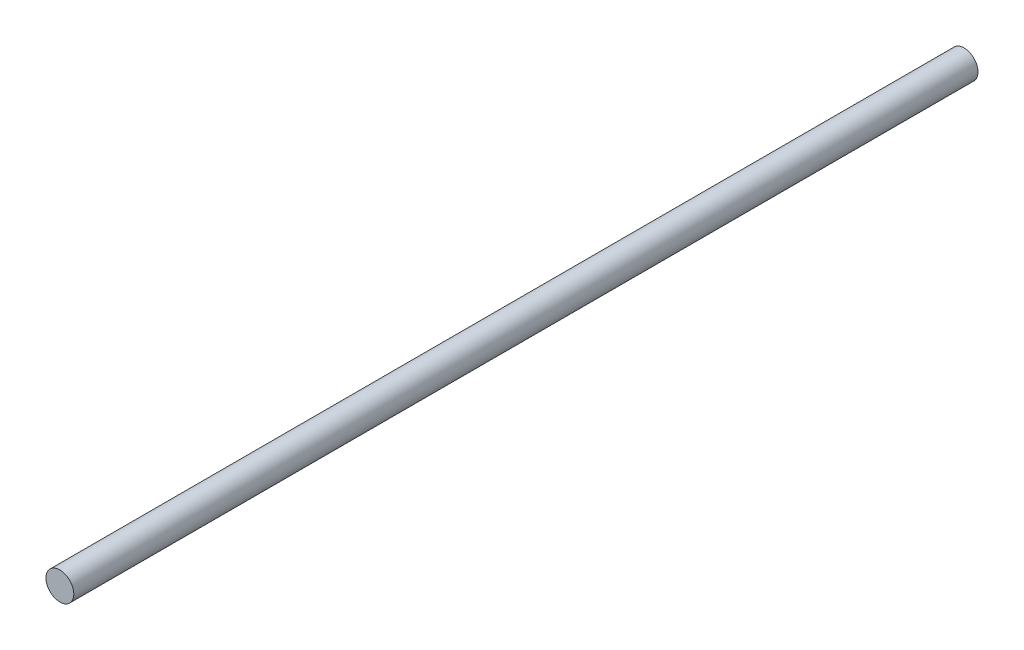
ISO-10303-21;
HEADER;
FILE_DESCRIPTION(('STEP AP214'),'2;1');
FILE_NAME('part.step','',(''),(''),'','','');
FILE_SCHEMA(('AUTOMOTIVE_DESIGN { 1 0 10303 214 1 1 1 1 }'));
ENDSEC;
DATA;
#1=APPLICATION_CONTEXT('core data for automotive mechanical design processes');
#2=APPLICATION_PROTOCOL_DEFINITION('international standard','automotive_design',2000,#1);
#3=PRODUCT_CONTEXT('',#1,'mechanical');
#4=PRODUCT('Part','Part','',(#3));
#5=PRODUCT_RELATED_PRODUCT_CATEGORY('part','',(#4));
#6=PRODUCT_DEFINITION_FORMATION('','',#4);
#7=PRODUCT_DEFINITION_CONTEXT('part definition',#1,'design');
#8=PRODUCT_DEFINITION('design','',#6,#7);
#9=PRODUCT_DEFINITION_SHAPE('','',#8);
#10=(LENGTH_UNIT() NAMED_UNIT(*) SI_UNIT(.MILLI.,.METRE.));
#11=(NAMED_UNIT(*) PLANE_ANGLE_UNIT() SI_UNIT($,.RADIAN.));
#12=(NAMED_UNIT(*) SI_UNIT($,.STERADIAN.) SOLID_ANGLE_UNIT());
#13=UNCERTAINTY_MEASURE_WITH_UNIT(LENGTH_MEASURE(1.E-05),#10,'distance_accuracy_value','');
#14=(GEOMETRIC_REPRESENTATION_CONTEXT(3) GLOBAL_UNCERTAINTY_ASSIGNED_CONTEXT((#13)) GLOBAL_UNIT_ASSIGNED_CONTEXT((#10,
#11,#12)) REPRESENTATION_CONTEXT('',''));
#15=CARTESIAN_POINT('',(0.,0.,0.));
#16=DIRECTION('',(0.,0.,1.));
#17=DIRECTION('',(1.,0.,0.));
#18=AXIS2_PLACEMENT_3D('',#15,#16,#17);
#19=CARTESIAN_POINT('',(0.,0.,130.));
#20=DIRECTION('',(0.,0.,-1.));
#21=DIRECTION('',(-1.,0.,0.));
#22=AXIS2_PLACEMENT_3D('',#19,#20,#21);
#23=CYLINDRICAL_SURFACE('',#22,4.);
#24=CARTESIAN_POINT('',(0.,0.,130.));
#25=DIRECTION('',(0.,0.,1.));
#26=DIRECTION('',(1.,0.,0.));
#27=AXIS2_PLACEMENT_3D('',#24,#25,#26);
#28=CIRCLE('',#27,4.);
#29=CARTESIAN_POINT('',(4.,0.,130.));
#30=VERTEX_POINT('',#29);
#31=EDGE_CURVE('E10',#30,#30,#28,.T.);
#32=ORIENTED_EDGE('',*,*,#31,.F.);
#33=EDGE_LOOP('',(#32));
#34=FACE_BOUND('',#33,.T.);
#35=CARTESIAN_POINT('',(0.,0.,-130.));
#36=DIRECTION('',(0.,0.,1.));
#37=DIRECTION('',(1.,0.,0.));
#38=AXIS2_PLACEMENT_3D('',#35,#36,#37);
#39=CIRCLE('',#38,4.);
#40=CARTESIAN_POINT('',(4.,0.,-130.));
#41=VERTEX_POINT('',#40);
#42=EDGE_CURVE('E40',#41,#41,#39,.T.);
#43=ORIENTED_EDGE('',*,*,#42,.T.);
#44=EDGE_LOOP('',(#43));
#45=FACE_BOUND('',#44,.T.);
#46=ADVANCED_FACE('F37',(#34,#45),#23,.T.);
#47=CARTESIAN_POINT('',(0.,0.,130.));
#48=DIRECTION('',(0.,0.,1.));
#49=DIRECTION('',(1.,0.,0.));
#50=AXIS2_PLACEMENT_3D('',#47,#48,#49);
#51=PLANE('',#50);
#52=ORIENTED_EDGE('',*,*,#31,.T.);
#53=EDGE_LOOP('',(#52));
#54=FACE_BOUND('',#53,.T.);
#55=ADVANCED_FACE('F52',(#54),#51,.T.);
#56=CARTESIAN_POINT('',(0.,0.,-130.));
#57=DIRECTION('',(0.,0.,1.));
#58=DIRECTION('',(1.,0.,0.));
#59=AXIS2_PLACEMENT_3D('',#56,#57,#58);
#60=PLANE('',#59);
#61=ORIENTED_EDGE('',*,*,#42,.F.);
#62=EDGE_LOOP('',(#61));
#63=FACE_BOUND('',#62,.T.);
#64=ADVANCED_FACE('F50',(#63),#60,.F.);
#65=CLOSED_SHELL('',(#46,#55,#64));
#66=MANIFOLD_SOLID_BREP('B2',#65);
#67=ADVANCED_BREP_SHAPE_REPRESENTATION('',(#18,#66),#14);
#68=SHAPE_DEFINITION_REPRESENTATION(#9,#67);
ENDSEC;
END-ISO-10303-21;
